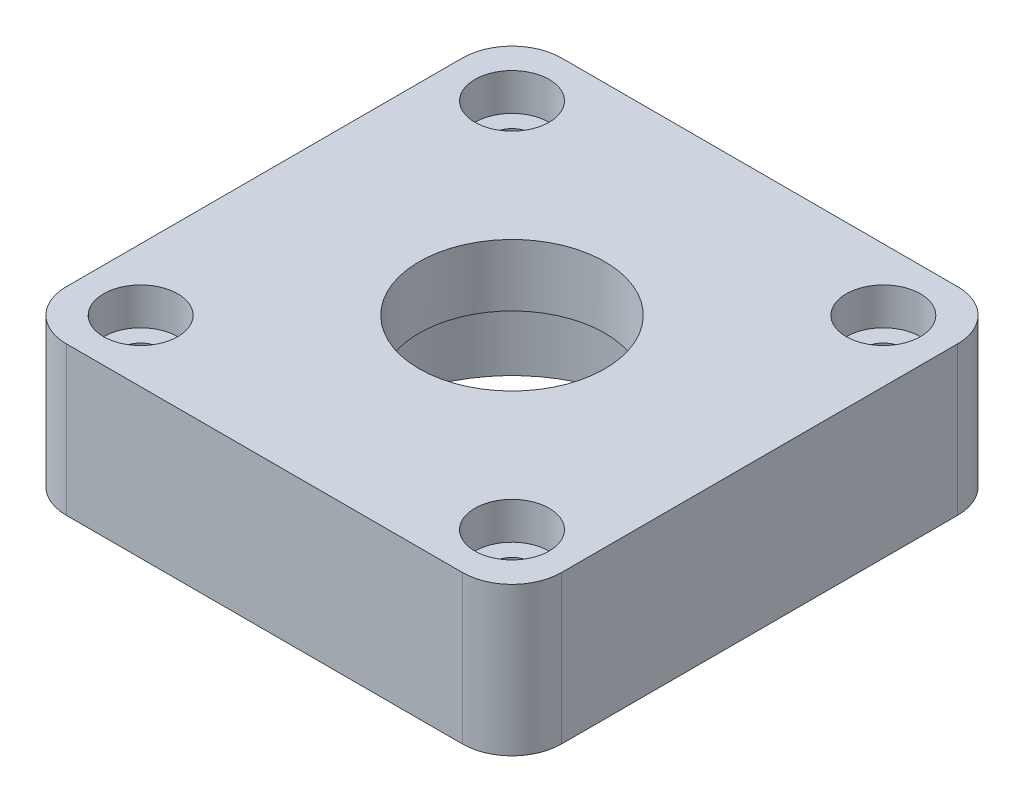
ISO-10303-21;
HEADER;
FILE_DESCRIPTION(('STEP AP214'),'2;1');
FILE_NAME('part.step','',(''),(''),'','','');
FILE_SCHEMA(('AUTOMOTIVE_DESIGN { 1 0 10303 214 1 1 1 1 }'));
ENDSEC;
DATA;
#1=APPLICATION_CONTEXT('core data for automotive mechanical design processes');
#2=APPLICATION_PROTOCOL_DEFINITION('international standard','automotive_design',2000,#1);
#3=PRODUCT_CONTEXT('',#1,'mechanical');
#4=PRODUCT('Part','Part','',(#3));
#5=PRODUCT_RELATED_PRODUCT_CATEGORY('part','',(#4));
#6=PRODUCT_DEFINITION_FORMATION('','',#4);
#7=PRODUCT_DEFINITION_CONTEXT('part definition',#1,'design');
#8=PRODUCT_DEFINITION('design','',#6,#7);
#9=PRODUCT_DEFINITION_SHAPE('','',#8);
#10=(LENGTH_UNIT() NAMED_UNIT(*) SI_UNIT(.MILLI.,.METRE.));
#11=(NAMED_UNIT(*) PLANE_ANGLE_UNIT() SI_UNIT($,.RADIAN.));
#12=(NAMED_UNIT(*) SI_UNIT($,.STERADIAN.) SOLID_ANGLE_UNIT());
#13=UNCERTAINTY_MEASURE_WITH_UNIT(LENGTH_MEASURE(1.E-05),#10,'distance_accuracy_value','');
#14=(GEOMETRIC_REPRESENTATION_CONTEXT(3) GLOBAL_UNCERTAINTY_ASSIGNED_CONTEXT((#13)) GLOBAL_UNIT_ASSIGNED_CONTEXT((#10,
#11,#12)) REPRESENTATION_CONTEXT('',''));
#15=CARTESIAN_POINT('',(0.,0.,0.));
#16=DIRECTION('',(0.,0.,1.));
#17=DIRECTION('',(1.,0.,0.));
#18=AXIS2_PLACEMENT_3D('',#15,#16,#17);
#19=CARTESIAN_POINT('',(15.,0.,-15.));
#20=DIRECTION('',(0.,1.,0.));
#21=DIRECTION('',(0.,0.,1.));
#22=AXIS2_PLACEMENT_3D('',#19,#20,#21);
#23=CYLINDRICAL_SURFACE('',#22,1.5);
#24=CARTESIAN_POINT('',(15.,0.,-15.));
#25=DIRECTION('',(0.,1.,0.));
#26=DIRECTION('',(0.,0.,-1.));
#27=AXIS2_PLACEMENT_3D('',#24,#25,#26);
#28=CIRCLE('',#27,1.5);
#29=CARTESIAN_POINT('',(15.,0.,-16.5));
#30=VERTEX_POINT('',#29);
#31=EDGE_CURVE('E190',#30,#30,#28,.T.);
#32=ORIENTED_EDGE('',*,*,#31,.F.);
#33=EDGE_LOOP('',(#32));
#34=FACE_BOUND('',#33,.T.);
#35=CARTESIAN_POINT('',(15.,9.,-15.));
#36=DIRECTION('',(0.,1.,0.));
#37=DIRECTION('',(0.,0.,1.));
#38=AXIS2_PLACEMENT_3D('',#35,#36,#37);
#39=CIRCLE('',#38,1.5);
#40=CARTESIAN_POINT('',(15.,9.,-13.5));
#41=VERTEX_POINT('',#40);
#42=EDGE_CURVE('E176',#41,#41,#39,.F.);
#43=ORIENTED_EDGE('',*,*,#42,.F.);
#44=EDGE_LOOP('',(#43));
#45=FACE_BOUND('',#44,.T.);
#46=ADVANCED_FACE('F37',(#34,#45),#23,.F.);
#47=CARTESIAN_POINT('',(-15.,0.,15.));
#48=DIRECTION('',(0.,1.,0.));
#49=DIRECTION('',(0.,0.,1.));
#50=AXIS2_PLACEMENT_3D('',#47,#48,#49);
#51=CYLINDRICAL_SURFACE('',#50,1.5);
#52=CARTESIAN_POINT('',(-15.,0.,15.));
#53=DIRECTION('',(0.,1.,0.));
#54=DIRECTION('',(0.,0.,-1.));
#55=AXIS2_PLACEMENT_3D('',#52,#53,#54);
#56=CIRCLE('',#55,1.5);
#57=CARTESIAN_POINT('',(-15.,0.,13.5));
#58=VERTEX_POINT('',#57);
#59=EDGE_CURVE('E181',#58,#58,#56,.T.);
#60=ORIENTED_EDGE('',*,*,#59,.F.);
#61=EDGE_LOOP('',(#60));
#62=FACE_BOUND('',#61,.T.);
#63=CARTESIAN_POINT('',(-15.,9.,15.));
#64=DIRECTION('',(0.,1.,0.));
#65=DIRECTION('',(0.,0.,1.));
#66=AXIS2_PLACEMENT_3D('',#63,#64,#65);
#67=CIRCLE('',#66,1.5);
#68=CARTESIAN_POINT('',(-15.,9.,16.5));
#69=VERTEX_POINT('',#68);
#70=EDGE_CURVE('E170',#69,#69,#67,.F.);
#71=ORIENTED_EDGE('',*,*,#70,.F.);
#72=EDGE_LOOP('',(#71));
#73=FACE_BOUND('',#72,.T.);
#74=ADVANCED_FACE('F236',(#62,#73),#51,.F.);
#75=CARTESIAN_POINT('',(20.,12.,-20.));
#76=DIRECTION('',(-1.,0.,0.));
#77=DIRECTION('',(0.,0.,1.));
#78=AXIS2_PLACEMENT_3D('',#75,#76,#77);
#79=PLANE('',#78);
#80=DIRECTION('',(0.,0.,-1.));
#81=VECTOR('',#80,1.);
#82=CARTESIAN_POINT('',(20.,0.,-20.));
#83=LINE('',#82,#81);
#84=CARTESIAN_POINT('',(20.,0.,16.));
#85=VERTEX_POINT('',#84);
#86=CARTESIAN_POINT('',(20.,0.,-16.));
#87=VERTEX_POINT('',#86);
#88=EDGE_CURVE('E132',#85,#87,#83,.T.);
#89=ORIENTED_EDGE('',*,*,#88,.T.);
#90=DIRECTION('',(0.,-1.,0.));
#91=VECTOR('',#90,1.);
#92=CARTESIAN_POINT('',(20.,12.,-16.));
#93=LINE('',#92,#91);
#94=CARTESIAN_POINT('',(20.,12.,-16.));
#95=VERTEX_POINT('',#94);
#96=EDGE_CURVE('E110',#87,#95,#93,.F.);
#97=ORIENTED_EDGE('',*,*,#96,.T.);
#98=DIRECTION('',(0.,0.,-1.));
#99=VECTOR('',#98,1.);
#100=CARTESIAN_POINT('',(20.,12.,-20.));
#101=LINE('',#100,#99);
#102=CARTESIAN_POINT('',(20.,12.,16.));
#103=VERTEX_POINT('',#102);
#104=EDGE_CURVE('E142',#103,#95,#101,.T.);
#105=ORIENTED_EDGE('',*,*,#104,.F.);
#106=DIRECTION('',(0.,-1.,0.));
#107=VECTOR('',#106,1.);
#108=CARTESIAN_POINT('',(20.,12.,16.));
#109=LINE('',#108,#107);
#110=EDGE_CURVE('E115',#103,#85,#109,.T.);
#111=ORIENTED_EDGE('',*,*,#110,.T.);
#112=EDGE_LOOP('',(#89,#97,#105,#111));
#113=FACE_BOUND('',#112,.T.);
#114=ADVANCED_FACE('F214',(#113),#79,.F.);
#115=CARTESIAN_POINT('',(-20.,12.,-20.));
#116=DIRECTION('',(0.,0.,1.));
#117=DIRECTION('',(1.,0.,0.));
#118=AXIS2_PLACEMENT_3D('',#115,#116,#117);
#119=PLANE('',#118);
#120=DIRECTION('',(-1.,0.,0.));
#121=VECTOR('',#120,1.);
#122=CARTESIAN_POINT('',(-20.,12.,-20.));
#123=LINE('',#122,#121);
#124=CARTESIAN_POINT('',(16.,12.,-20.));
#125=VERTEX_POINT('',#124);
#126=CARTESIAN_POINT('',(-16.,12.,-20.));
#127=VERTEX_POINT('',#126);
#128=EDGE_CURVE('E125',#125,#127,#123,.T.);
#129=ORIENTED_EDGE('',*,*,#128,.F.);
#130=DIRECTION('',(0.,-1.,0.));
#131=VECTOR('',#130,1.);
#132=CARTESIAN_POINT('',(16.,12.,-20.));
#133=LINE('',#132,#131);
#134=CARTESIAN_POINT('',(16.,0.,-20.));
#135=VERTEX_POINT('',#134);
#136=EDGE_CURVE('E109',#125,#135,#133,.T.);
#137=ORIENTED_EDGE('',*,*,#136,.T.);
#138=DIRECTION('',(-1.,0.,0.));
#139=VECTOR('',#138,1.);
#140=CARTESIAN_POINT('',(-20.,0.,-20.));
#141=LINE('',#140,#139);
#142=CARTESIAN_POINT('',(-16.,0.,-20.));
#143=VERTEX_POINT('',#142);
#144=EDGE_CURVE('E122',#135,#143,#141,.T.);
#145=ORIENTED_EDGE('',*,*,#144,.T.);
#146=DIRECTION('',(0.,-1.,0.));
#147=VECTOR('',#146,1.);
#148=CARTESIAN_POINT('',(-16.,12.,-20.));
#149=LINE('',#148,#147);
#150=EDGE_CURVE('E127',#143,#127,#149,.F.);
#151=ORIENTED_EDGE('',*,*,#150,.T.);
#152=EDGE_LOOP('',(#129,#137,#145,#151));
#153=FACE_BOUND('',#152,.T.);
#154=ADVANCED_FACE('F121',(#153),#119,.F.);
#155=CARTESIAN_POINT('',(-20.,12.,-20.));
#156=DIRECTION('',(1.,0.,0.));
#157=DIRECTION('',(0.,0.,-1.));
#158=AXIS2_PLACEMENT_3D('',#155,#156,#157);
#159=PLANE('',#158);
#160=DIRECTION('',(0.,0.,1.));
#161=VECTOR('',#160,1.);
#162=CARTESIAN_POINT('',(-20.,12.,-20.));
#163=LINE('',#162,#161);
#164=CARTESIAN_POINT('',(-20.,12.,-16.));
#165=VERTEX_POINT('',#164);
#166=CARTESIAN_POINT('',(-20.,12.,16.));
#167=VERTEX_POINT('',#166);
#168=EDGE_CURVE('E206',#165,#167,#163,.T.);
#169=ORIENTED_EDGE('',*,*,#168,.F.);
#170=DIRECTION('',(0.,-1.,0.));
#171=VECTOR('',#170,1.);
#172=CARTESIAN_POINT('',(-20.,12.,-16.));
#173=LINE('',#172,#171);
#174=CARTESIAN_POINT('',(-20.,0.,-16.));
#175=VERTEX_POINT('',#174);
#176=EDGE_CURVE('E166',#165,#175,#173,.T.);
#177=ORIENTED_EDGE('',*,*,#176,.T.);
#178=DIRECTION('',(0.,0.,1.));
#179=VECTOR('',#178,1.);
#180=CARTESIAN_POINT('',(-20.,0.,-20.));
#181=LINE('',#180,#179);
#182=CARTESIAN_POINT('',(-20.,0.,16.));
#183=VERTEX_POINT('',#182);
#184=EDGE_CURVE('E131',#175,#183,#181,.T.);
#185=ORIENTED_EDGE('',*,*,#184,.T.);
#186=DIRECTION('',(0.,-1.,0.));
#187=VECTOR('',#186,1.);
#188=CARTESIAN_POINT('',(-20.,12.,16.));
#189=LINE('',#188,#187);
#190=EDGE_CURVE('E164',#183,#167,#189,.F.);
#191=ORIENTED_EDGE('',*,*,#190,.T.);
#192=EDGE_LOOP('',(#169,#177,#185,#191));
#193=FACE_BOUND('',#192,.T.);
#194=ADVANCED_FACE('F222',(#193),#159,.F.);
#195=CARTESIAN_POINT('',(-20.,12.,20.));
#196=DIRECTION('',(0.,0.,-1.));
#197=DIRECTION('',(-1.,0.,0.));
#198=AXIS2_PLACEMENT_3D('',#195,#196,#197);
#199=PLANE('',#198);
#200=DIRECTION('',(1.,0.,0.));
#201=VECTOR('',#200,1.);
#202=CARTESIAN_POINT('',(-20.,12.,20.));
#203=LINE('',#202,#201);
#204=CARTESIAN_POINT('',(-16.,12.,20.));
#205=VERTEX_POINT('',#204);
#206=CARTESIAN_POINT('',(16.,12.,20.));
#207=VERTEX_POINT('',#206);
#208=EDGE_CURVE('E148',#205,#207,#203,.T.);
#209=ORIENTED_EDGE('',*,*,#208,.F.);
#210=DIRECTION('',(0.,-1.,0.));
#211=VECTOR('',#210,1.);
#212=CARTESIAN_POINT('',(-16.,12.,20.));
#213=LINE('',#212,#211);
#214=CARTESIAN_POINT('',(-16.,0.,20.));
#215=VERTEX_POINT('',#214);
#216=EDGE_CURVE('E11',#205,#215,#213,.T.);
#217=ORIENTED_EDGE('',*,*,#216,.T.);
#218=DIRECTION('',(1.,0.,0.));
#219=VECTOR('',#218,1.);
#220=CARTESIAN_POINT('',(-20.,0.,20.));
#221=LINE('',#220,#219);
#222=CARTESIAN_POINT('',(16.,0.,20.));
#223=VERTEX_POINT('',#222);
#224=EDGE_CURVE('E135',#215,#223,#221,.T.);
#225=ORIENTED_EDGE('',*,*,#224,.T.);
#226=DIRECTION('',(0.,-1.,0.));
#227=VECTOR('',#226,1.);
#228=CARTESIAN_POINT('',(16.,12.,20.));
#229=LINE('',#228,#227);
#230=EDGE_CURVE('E46',#223,#207,#229,.F.);
#231=ORIENTED_EDGE('',*,*,#230,.T.);
#232=EDGE_LOOP('',(#209,#217,#225,#231));
#233=FACE_BOUND('',#232,.T.);
#234=ADVANCED_FACE('F216',(#233),#199,.F.);
#235=CARTESIAN_POINT('',(0.,12.,0.));
#236=DIRECTION('',(0.,1.,0.));
#237=DIRECTION('',(0.,0.,1.));
#238=AXIS2_PLACEMENT_3D('',#235,#236,#237);
#239=PLANE('',#238);
#240=CARTESIAN_POINT('',(-15.,12.,-15.));
#241=DIRECTION('',(0.,1.,0.));
#242=DIRECTION('',(0.,0.,-1.));
#243=AXIS2_PLACEMENT_3D('',#240,#241,#242);
#244=CIRCLE('',#243,3.);
#245=CARTESIAN_POINT('',(-15.,12.,-18.));
#246=VERTEX_POINT('',#245);
#247=EDGE_CURVE('E444',#246,#246,#244,.T.);
#248=ORIENTED_EDGE('',*,*,#247,.F.);
#249=EDGE_LOOP('',(#248));
#250=FACE_BOUND('',#249,.T.);
#251=CARTESIAN_POINT('',(15.,12.,15.));
#252=DIRECTION('',(0.,1.,0.));
#253=DIRECTION('',(0.,0.,-1.));
#254=AXIS2_PLACEMENT_3D('',#251,#252,#253);
#255=CIRCLE('',#254,3.);
#256=CARTESIAN_POINT('',(15.,12.,12.));
#257=VERTEX_POINT('',#256);
#258=EDGE_CURVE('E450',#257,#257,#255,.T.);
#259=ORIENTED_EDGE('',*,*,#258,.F.);
#260=EDGE_LOOP('',(#259));
#261=FACE_BOUND('',#260,.T.);
#262=CARTESIAN_POINT('',(15.,12.,-15.));
#263=DIRECTION('',(0.,1.,0.));
#264=DIRECTION('',(0.,0.,1.));
#265=AXIS2_PLACEMENT_3D('',#262,#263,#264);
#266=CIRCLE('',#265,3.);
#267=CARTESIAN_POINT('',(15.,12.,-12.));
#268=VERTEX_POINT('',#267);
#269=EDGE_CURVE('E481',#268,#268,#266,.T.);
#270=ORIENTED_EDGE('',*,*,#269,.F.);
#271=EDGE_LOOP('',(#270));
#272=FACE_BOUND('',#271,.T.);
#273=CARTESIAN_POINT('',(-15.,12.,15.));
#274=DIRECTION('',(0.,1.,0.));
#275=DIRECTION('',(0.,0.,1.));
#276=AXIS2_PLACEMENT_3D('',#273,#274,#275);
#277=CIRCLE('',#276,3.);
#278=CARTESIAN_POINT('',(-15.,12.,18.));
#279=VERTEX_POINT('',#278);
#280=EDGE_CURVE('E447',#279,#279,#277,.T.);
#281=ORIENTED_EDGE('',*,*,#280,.F.);
#282=EDGE_LOOP('',(#281));
#283=FACE_BOUND('',#282,.T.);
#284=CARTESIAN_POINT('',(0.,12.,0.));
#285=DIRECTION('',(0.,1.,0.));
#286=DIRECTION('',(0.,0.,1.));
#287=AXIS2_PLACEMENT_3D('',#284,#285,#286);
#288=CIRCLE('',#287,7.5);
#289=CARTESIAN_POINT('',(0.,12.,7.5));
#290=VERTEX_POINT('',#289);
#291=EDGE_CURVE('E147',#290,#290,#288,.T.);
#292=ORIENTED_EDGE('',*,*,#291,.F.);
#293=EDGE_LOOP('',(#292));
#294=FACE_BOUND('',#293,.T.);
#295=ORIENTED_EDGE('',*,*,#104,.T.);
#296=CARTESIAN_POINT('',(16.,12.,-16.));
#297=DIRECTION('',(0.,1.,0.));
#298=DIRECTION('',(0.,0.,1.));
#299=AXIS2_PLACEMENT_3D('',#296,#297,#298);
#300=CIRCLE('',#299,4.);
#301=EDGE_CURVE('E162',#95,#125,#300,.T.);
#302=ORIENTED_EDGE('',*,*,#301,.T.);
#303=ORIENTED_EDGE('',*,*,#128,.T.);
#304=CARTESIAN_POINT('',(-16.,12.,-16.));
#305=DIRECTION('',(0.,1.,0.));
#306=DIRECTION('',(0.,0.,1.));
#307=AXIS2_PLACEMENT_3D('',#304,#305,#306);
#308=CIRCLE('',#307,4.);
#309=EDGE_CURVE('E160',#127,#165,#308,.T.);
#310=ORIENTED_EDGE('',*,*,#309,.T.);
#311=ORIENTED_EDGE('',*,*,#168,.T.);
#312=CARTESIAN_POINT('',(-16.,12.,16.));
#313=DIRECTION('',(0.,1.,0.));
#314=DIRECTION('',(0.,0.,1.));
#315=AXIS2_PLACEMENT_3D('',#312,#313,#314);
#316=CIRCLE('',#315,4.);
#317=EDGE_CURVE('E60',#167,#205,#316,.T.);
#318=ORIENTED_EDGE('',*,*,#317,.T.);
#319=ORIENTED_EDGE('',*,*,#208,.T.);
#320=CARTESIAN_POINT('',(16.,12.,16.));
#321=DIRECTION('',(0.,1.,0.));
#322=DIRECTION('',(0.,0.,1.));
#323=AXIS2_PLACEMENT_3D('',#320,#321,#322);
#324=CIRCLE('',#323,4.);
#325=EDGE_CURVE('E157',#207,#103,#324,.T.);
#326=ORIENTED_EDGE('',*,*,#325,.T.);
#327=EDGE_LOOP('',(#295,#302,#303,#310,#311,#318,#319,#326));
#328=FACE_BOUND('',#327,.T.);
#329=ADVANCED_FACE('F208',(#250,#261,#272,#283,#294,#328),#239,.T.);
#330=CARTESIAN_POINT('',(0.,0.,0.));
#331=DIRECTION('',(0.,1.,0.));
#332=DIRECTION('',(0.,0.,1.));
#333=AXIS2_PLACEMENT_3D('',#330,#331,#332);
#334=PLANE('',#333);
#335=ORIENTED_EDGE('',*,*,#59,.T.);
#336=EDGE_LOOP('',(#335));
#337=FACE_BOUND('',#336,.T.);
#338=CARTESIAN_POINT('',(15.,0.,15.));
#339=DIRECTION('',(0.,1.,0.));
#340=DIRECTION('',(0.,0.,1.));
#341=AXIS2_PLACEMENT_3D('',#338,#339,#340);
#342=CIRCLE('',#341,1.5);
#343=CARTESIAN_POINT('',(15.,0.,16.5));
#344=VERTEX_POINT('',#343);
#345=EDGE_CURVE('E185',#344,#344,#342,.T.);
#346=ORIENTED_EDGE('',*,*,#345,.T.);
#347=EDGE_LOOP('',(#346));
#348=FACE_BOUND('',#347,.T.);
#349=ORIENTED_EDGE('',*,*,#31,.T.);
#350=EDGE_LOOP('',(#349));
#351=FACE_BOUND('',#350,.T.);
#352=CARTESIAN_POINT('',(-15.,0.,-15.));
#353=DIRECTION('',(0.,1.,0.));
#354=DIRECTION('',(0.,0.,1.));
#355=AXIS2_PLACEMENT_3D('',#352,#353,#354);
#356=CIRCLE('',#355,1.5);
#357=CARTESIAN_POINT('',(-15.,0.,-13.5));
#358=VERTEX_POINT('',#357);
#359=EDGE_CURVE('E194',#358,#358,#356,.T.);
#360=ORIENTED_EDGE('',*,*,#359,.T.);
#361=EDGE_LOOP('',(#360));
#362=FACE_BOUND('',#361,.T.);
#363=CARTESIAN_POINT('',(0.,0.,0.));
#364=DIRECTION('',(0.,-1.,0.));
#365=DIRECTION('',(0.,0.,-1.));
#366=AXIS2_PLACEMENT_3D('',#363,#364,#365);
#367=CIRCLE('',#366,11.);
#368=CARTESIAN_POINT('',(0.,0.,-11.));
#369=VERTEX_POINT('',#368);
#370=EDGE_CURVE('E146',#369,#369,#367,.T.);
#371=ORIENTED_EDGE('',*,*,#370,.F.);
#372=EDGE_LOOP('',(#371));
#373=FACE_BOUND('',#372,.T.);
#374=ORIENTED_EDGE('',*,*,#144,.F.);
#375=CARTESIAN_POINT('',(16.,0.,-16.));
#376=DIRECTION('',(0.,1.,0.));
#377=DIRECTION('',(0.,0.,1.));
#378=AXIS2_PLACEMENT_3D('',#375,#376,#377);
#379=CIRCLE('',#378,4.);
#380=EDGE_CURVE('E105',#135,#87,#379,.F.);
#381=ORIENTED_EDGE('',*,*,#380,.T.);
#382=ORIENTED_EDGE('',*,*,#88,.F.);
#383=CARTESIAN_POINT('',(16.,0.,16.));
#384=DIRECTION('',(0.,1.,0.));
#385=DIRECTION('',(0.,0.,1.));
#386=AXIS2_PLACEMENT_3D('',#383,#384,#385);
#387=CIRCLE('',#386,4.);
#388=EDGE_CURVE('E126',#85,#223,#387,.F.);
#389=ORIENTED_EDGE('',*,*,#388,.T.);
#390=ORIENTED_EDGE('',*,*,#224,.F.);
#391=CARTESIAN_POINT('',(-16.,0.,16.));
#392=DIRECTION('',(0.,1.,0.));
#393=DIRECTION('',(0.,0.,1.));
#394=AXIS2_PLACEMENT_3D('',#391,#392,#393);
#395=CIRCLE('',#394,4.);
#396=EDGE_CURVE('E151',#215,#183,#395,.F.);
#397=ORIENTED_EDGE('',*,*,#396,.T.);
#398=ORIENTED_EDGE('',*,*,#184,.F.);
#399=CARTESIAN_POINT('',(-16.,0.,-16.));
#400=DIRECTION('',(0.,1.,0.));
#401=DIRECTION('',(0.,0.,1.));
#402=AXIS2_PLACEMENT_3D('',#399,#400,#401);
#403=CIRCLE('',#402,4.);
#404=EDGE_CURVE('E116',#175,#143,#403,.F.);
#405=ORIENTED_EDGE('',*,*,#404,.T.);
#406=EDGE_LOOP('',(#374,#381,#382,#389,#390,#397,#398,#405));
#407=FACE_BOUND('',#406,.T.);
#408=ADVANCED_FACE('F129',(#337,#348,#351,#362,#373,#407),#334,.F.);
#409=CARTESIAN_POINT('',(0.,7.,0.));
#410=DIRECTION('',(0.,-1.,0.));
#411=DIRECTION('',(0.,0.,-1.));
#412=AXIS2_PLACEMENT_3D('',#409,#410,#411);
#413=CYLINDRICAL_SURFACE('',#412,11.);
#414=CARTESIAN_POINT('',(0.,7.,0.));
#415=DIRECTION('',(0.,-1.,0.));
#416=DIRECTION('',(0.,0.,-1.));
#417=AXIS2_PLACEMENT_3D('',#414,#415,#416);
#418=CIRCLE('',#417,11.);
#419=CARTESIAN_POINT('',(0.,7.,-11.));
#420=VERTEX_POINT('',#419);
#421=EDGE_CURVE('E137',#420,#420,#418,.T.);
#422=ORIENTED_EDGE('',*,*,#421,.F.);
#423=EDGE_LOOP('',(#422));
#424=FACE_BOUND('',#423,.T.);
#425=ORIENTED_EDGE('',*,*,#370,.T.);
#426=EDGE_LOOP('',(#425));
#427=FACE_BOUND('',#426,.T.);
#428=ADVANCED_FACE('F264',(#424,#427),#413,.F.);
#429=CARTESIAN_POINT('',(0.,7.,0.));
#430=DIRECTION('',(0.,-1.,0.));
#431=DIRECTION('',(0.,0.,-1.));
#432=AXIS2_PLACEMENT_3D('',#429,#430,#431);
#433=PLANE('',#432);
#434=CARTESIAN_POINT('',(0.,7.,0.));
#435=DIRECTION('',(0.,-1.,0.));
#436=DIRECTION('',(0.,0.,-1.));
#437=AXIS2_PLACEMENT_3D('',#434,#435,#436);
#438=CIRCLE('',#437,7.5);
#439=CARTESIAN_POINT('',(0.,7.,-7.5));
#440=VERTEX_POINT('',#439);
#441=EDGE_CURVE('E143',#440,#440,#438,.T.);
#442=ORIENTED_EDGE('',*,*,#441,.F.);
#443=EDGE_LOOP('',(#442));
#444=FACE_BOUND('',#443,.T.);
#445=ORIENTED_EDGE('',*,*,#421,.T.);
#446=EDGE_LOOP('',(#445));
#447=FACE_BOUND('',#446,.T.);
#448=ADVANCED_FACE('F260',(#444,#447),#433,.T.);
#449=CARTESIAN_POINT('',(0.,0.,0.));
#450=DIRECTION('',(0.,1.,0.));
#451=DIRECTION('',(0.,0.,1.));
#452=AXIS2_PLACEMENT_3D('',#449,#450,#451);
#453=CYLINDRICAL_SURFACE('',#452,7.5);
#454=ORIENTED_EDGE('',*,*,#441,.T.);
#455=EDGE_LOOP('',(#454));
#456=FACE_BOUND('',#455,.T.);
#457=ORIENTED_EDGE('',*,*,#291,.T.);
#458=EDGE_LOOP('',(#457));
#459=FACE_BOUND('',#458,.T.);
#460=ADVANCED_FACE('F233',(#456,#459),#453,.F.);
#461=CARTESIAN_POINT('',(16.,12.,-16.));
#462=DIRECTION('',(0.,-1.,0.));
#463=DIRECTION('',(0.,0.,-1.));
#464=AXIS2_PLACEMENT_3D('',#461,#462,#463);
#465=CYLINDRICAL_SURFACE('',#464,4.);
#466=ORIENTED_EDGE('',*,*,#301,.F.);
#467=ORIENTED_EDGE('',*,*,#96,.F.);
#468=ORIENTED_EDGE('',*,*,#380,.F.);
#469=ORIENTED_EDGE('',*,*,#136,.F.);
#470=EDGE_LOOP('',(#466,#467,#468,#469));
#471=FACE_BOUND('',#470,.T.);
#472=ADVANCED_FACE('F108',(#471),#465,.T.);
#473=CARTESIAN_POINT('',(-16.,12.,-16.));
#474=DIRECTION('',(0.,-1.,0.));
#475=DIRECTION('',(0.,0.,-1.));
#476=AXIS2_PLACEMENT_3D('',#473,#474,#475);
#477=CYLINDRICAL_SURFACE('',#476,4.);
#478=ORIENTED_EDGE('',*,*,#309,.F.);
#479=ORIENTED_EDGE('',*,*,#150,.F.);
#480=ORIENTED_EDGE('',*,*,#404,.F.);
#481=ORIENTED_EDGE('',*,*,#176,.F.);
#482=EDGE_LOOP('',(#478,#479,#480,#481));
#483=FACE_BOUND('',#482,.T.);
#484=ADVANCED_FACE('F226',(#483),#477,.T.);
#485=CARTESIAN_POINT('',(-16.,12.,16.));
#486=DIRECTION('',(0.,-1.,0.));
#487=DIRECTION('',(0.,0.,-1.));
#488=AXIS2_PLACEMENT_3D('',#485,#486,#487);
#489=CYLINDRICAL_SURFACE('',#488,4.);
#490=ORIENTED_EDGE('',*,*,#317,.F.);
#491=ORIENTED_EDGE('',*,*,#190,.F.);
#492=ORIENTED_EDGE('',*,*,#396,.F.);
#493=ORIENTED_EDGE('',*,*,#216,.F.);
#494=EDGE_LOOP('',(#490,#491,#492,#493));
#495=FACE_BOUND('',#494,.T.);
#496=ADVANCED_FACE('F218',(#495),#489,.T.);
#497=CARTESIAN_POINT('',(16.,12.,16.));
#498=DIRECTION('',(0.,-1.,0.));
#499=DIRECTION('',(0.,0.,-1.));
#500=AXIS2_PLACEMENT_3D('',#497,#498,#499);
#501=CYLINDRICAL_SURFACE('',#500,4.);
#502=ORIENTED_EDGE('',*,*,#325,.F.);
#503=ORIENTED_EDGE('',*,*,#230,.F.);
#504=ORIENTED_EDGE('',*,*,#388,.F.);
#505=ORIENTED_EDGE('',*,*,#110,.F.);
#506=EDGE_LOOP('',(#502,#503,#504,#505));
#507=FACE_BOUND('',#506,.T.);
#508=ADVANCED_FACE('F39',(#507),#501,.T.);
#509=CARTESIAN_POINT('',(-15.,0.,-15.));
#510=DIRECTION('',(0.,1.,0.));
#511=DIRECTION('',(0.,0.,1.));
#512=AXIS2_PLACEMENT_3D('',#509,#510,#511);
#513=CYLINDRICAL_SURFACE('',#512,1.5);
#514=CARTESIAN_POINT('',(-15.,9.,-15.));
#515=DIRECTION('',(0.,-1.,0.));
#516=DIRECTION('',(0.,0.,-1.));
#517=AXIS2_PLACEMENT_3D('',#514,#515,#516);
#518=CIRCLE('',#517,1.5);
#519=CARTESIAN_POINT('',(-15.,9.,-16.5));
#520=VERTEX_POINT('',#519);
#521=EDGE_CURVE('E41',#520,#520,#518,.F.);
#522=ORIENTED_EDGE('',*,*,#521,.T.);
#523=EDGE_LOOP('',(#522));
#524=FACE_BOUND('',#523,.T.);
#525=ORIENTED_EDGE('',*,*,#359,.F.);
#526=EDGE_LOOP('',(#525));
#527=FACE_BOUND('',#526,.T.);
#528=ADVANCED_FACE('F253',(#524,#527),#513,.F.);
#529=CARTESIAN_POINT('',(15.,0.,15.));
#530=DIRECTION('',(0.,1.,0.));
#531=DIRECTION('',(0.,0.,1.));
#532=AXIS2_PLACEMENT_3D('',#529,#530,#531);
#533=CYLINDRICAL_SURFACE('',#532,1.5);
#534=CARTESIAN_POINT('',(15.,9.,15.));
#535=DIRECTION('',(0.,-1.,0.));
#536=DIRECTION('',(0.,0.,-1.));
#537=AXIS2_PLACEMENT_3D('',#534,#535,#536);
#538=CIRCLE('',#537,1.5);
#539=CARTESIAN_POINT('',(15.,9.,13.5));
#540=VERTEX_POINT('',#539);
#541=EDGE_CURVE('E173',#540,#540,#538,.F.);
#542=ORIENTED_EDGE('',*,*,#541,.T.);
#543=EDGE_LOOP('',(#542));
#544=FACE_BOUND('',#543,.T.);
#545=ORIENTED_EDGE('',*,*,#345,.F.);
#546=EDGE_LOOP('',(#545));
#547=FACE_BOUND('',#546,.T.);
#548=ADVANCED_FACE('F250',(#544,#547),#533,.F.);
#549=CARTESIAN_POINT('',(-15.,9.,15.));
#550=DIRECTION('',(0.,1.,0.));
#551=DIRECTION('',(0.,0.,1.));
#552=AXIS2_PLACEMENT_3D('',#549,#550,#551);
#553=PLANE('',#552);
#554=CARTESIAN_POINT('',(-15.,9.,15.));
#555=DIRECTION('',(0.,1.,0.));
#556=DIRECTION('',(0.,0.,1.));
#557=AXIS2_PLACEMENT_3D('',#554,#555,#556);
#558=CIRCLE('',#557,3.);
#559=CARTESIAN_POINT('',(-15.,9.,18.));
#560=VERTEX_POINT('',#559);
#561=EDGE_CURVE('E174',#560,#560,#558,.T.);
#562=ORIENTED_EDGE('',*,*,#561,.T.);
#563=EDGE_LOOP('',(#562));
#564=FACE_BOUND('',#563,.T.);
#565=ORIENTED_EDGE('',*,*,#70,.T.);
#566=EDGE_LOOP('',(#565));
#567=FACE_BOUND('',#566,.T.);
#568=ADVANCED_FACE('F252',(#564,#567),#553,.T.);
#569=CARTESIAN_POINT('',(-15.,9.,15.));
#570=DIRECTION('',(0.,1.,0.));
#571=DIRECTION('',(0.,0.,1.));
#572=AXIS2_PLACEMENT_3D('',#569,#570,#571);
#573=CYLINDRICAL_SURFACE('',#572,3.);
#574=ORIENTED_EDGE('',*,*,#561,.F.);
#575=EDGE_LOOP('',(#574));
#576=FACE_BOUND('',#575,.T.);
#577=ORIENTED_EDGE('',*,*,#280,.T.);
#578=EDGE_LOOP('',(#577));
#579=FACE_BOUND('',#578,.T.);
#580=ADVANCED_FACE('F248',(#576,#579),#573,.F.);
#581=CARTESIAN_POINT('',(15.,9.,15.));
#582=DIRECTION('',(0.,-1.,0.));
#583=DIRECTION('',(0.,0.,-1.));
#584=AXIS2_PLACEMENT_3D('',#581,#582,#583);
#585=PLANE('',#584);
#586=CARTESIAN_POINT('',(15.,9.,15.));
#587=DIRECTION('',(0.,1.,0.));
#588=DIRECTION('',(0.,0.,-1.));
#589=AXIS2_PLACEMENT_3D('',#586,#587,#588);
#590=CIRCLE('',#589,3.);
#591=CARTESIAN_POINT('',(15.,9.,12.));
#592=VERTEX_POINT('',#591);
#593=EDGE_CURVE('E445',#592,#592,#590,.T.);
#594=ORIENTED_EDGE('',*,*,#593,.T.);
#595=EDGE_LOOP('',(#594));
#596=FACE_BOUND('',#595,.T.);
#597=ORIENTED_EDGE('',*,*,#541,.F.);
#598=EDGE_LOOP('',(#597));
#599=FACE_BOUND('',#598,.T.);
#600=ADVANCED_FACE('F360',(#596,#599),#585,.F.);
#601=CARTESIAN_POINT('',(15.,9.,15.));
#602=DIRECTION('',(0.,1.,0.));
#603=DIRECTION('',(0.,0.,1.));
#604=AXIS2_PLACEMENT_3D('',#601,#602,#603);
#605=CYLINDRICAL_SURFACE('',#604,3.);
#606=ORIENTED_EDGE('',*,*,#593,.F.);
#607=EDGE_LOOP('',(#606));
#608=FACE_BOUND('',#607,.T.);
#609=ORIENTED_EDGE('',*,*,#258,.T.);
#610=EDGE_LOOP('',(#609));
#611=FACE_BOUND('',#610,.T.);
#612=ADVANCED_FACE('F367',(#608,#611),#605,.F.);
#613=CARTESIAN_POINT('',(15.,9.,-15.));
#614=DIRECTION('',(0.,1.,0.));
#615=DIRECTION('',(0.,0.,1.));
#616=AXIS2_PLACEMENT_3D('',#613,#614,#615);
#617=PLANE('',#616);
#618=CARTESIAN_POINT('',(15.,9.,-15.));
#619=DIRECTION('',(0.,1.,0.));
#620=DIRECTION('',(0.,0.,1.));
#621=AXIS2_PLACEMENT_3D('',#618,#619,#620);
#622=CIRCLE('',#621,3.);
#623=CARTESIAN_POINT('',(15.,9.,-12.));
#624=VERTEX_POINT('',#623);
#625=EDGE_CURVE('E456',#624,#624,#622,.T.);
#626=ORIENTED_EDGE('',*,*,#625,.T.);
#627=EDGE_LOOP('',(#626));
#628=FACE_BOUND('',#627,.T.);
#629=ORIENTED_EDGE('',*,*,#42,.T.);
#630=EDGE_LOOP('',(#629));
#631=FACE_BOUND('',#630,.T.);
#632=ADVANCED_FACE('F375',(#628,#631),#617,.T.);
#633=CARTESIAN_POINT('',(15.,9.,-15.));
#634=DIRECTION('',(0.,1.,0.));
#635=DIRECTION('',(0.,0.,1.));
#636=AXIS2_PLACEMENT_3D('',#633,#634,#635);
#637=CYLINDRICAL_SURFACE('',#636,3.);
#638=ORIENTED_EDGE('',*,*,#625,.F.);
#639=EDGE_LOOP('',(#638));
#640=FACE_BOUND('',#639,.T.);
#641=ORIENTED_EDGE('',*,*,#269,.T.);
#642=EDGE_LOOP('',(#641));
#643=FACE_BOUND('',#642,.T.);
#644=ADVANCED_FACE('F383',(#640,#643),#637,.F.);
#645=CARTESIAN_POINT('',(-15.,9.,-15.));
#646=DIRECTION('',(0.,-1.,0.));
#647=DIRECTION('',(0.,0.,-1.));
#648=AXIS2_PLACEMENT_3D('',#645,#646,#647);
#649=PLANE('',#648);
#650=CARTESIAN_POINT('',(-15.,9.,-15.));
#651=DIRECTION('',(0.,1.,0.));
#652=DIRECTION('',(0.,0.,-1.));
#653=AXIS2_PLACEMENT_3D('',#650,#651,#652);
#654=CIRCLE('',#653,3.);
#655=CARTESIAN_POINT('',(-15.,9.,-18.));
#656=VERTEX_POINT('',#655);
#657=EDGE_CURVE('E441',#656,#656,#654,.T.);
#658=ORIENTED_EDGE('',*,*,#657,.T.);
#659=EDGE_LOOP('',(#658));
#660=FACE_BOUND('',#659,.T.);
#661=ORIENTED_EDGE('',*,*,#521,.F.);
#662=EDGE_LOOP('',(#661));
#663=FACE_BOUND('',#662,.T.);
#664=ADVANCED_FACE('F391',(#660,#663),#649,.F.);
#665=CARTESIAN_POINT('',(-15.,9.,-15.));
#666=DIRECTION('',(0.,1.,0.));
#667=DIRECTION('',(0.,0.,1.));
#668=AXIS2_PLACEMENT_3D('',#665,#666,#667);
#669=CYLINDRICAL_SURFACE('',#668,3.);
#670=ORIENTED_EDGE('',*,*,#657,.F.);
#671=EDGE_LOOP('',(#670));
#672=FACE_BOUND('',#671,.T.);
#673=ORIENTED_EDGE('',*,*,#247,.T.);
#674=EDGE_LOOP('',(#673));
#675=FACE_BOUND('',#674,.T.);
#676=ADVANCED_FACE('F399',(#672,#675),#669,.F.);
#677=CLOSED_SHELL('',(#46,#74,#114,#154,#194,#234,#329,#408,#428,#448,#460,#472,#484,#496,#508,
#528,#548,#568,#580,#600,#612,#632,#644,#664,#676));
#678=MANIFOLD_SOLID_BREP('B2',#677);
#679=ADVANCED_BREP_SHAPE_REPRESENTATION('',(#18,#678),#14);
#680=SHAPE_DEFINITION_REPRESENTATION(#9,#679);
ENDSEC;
END-ISO-10303-21;
